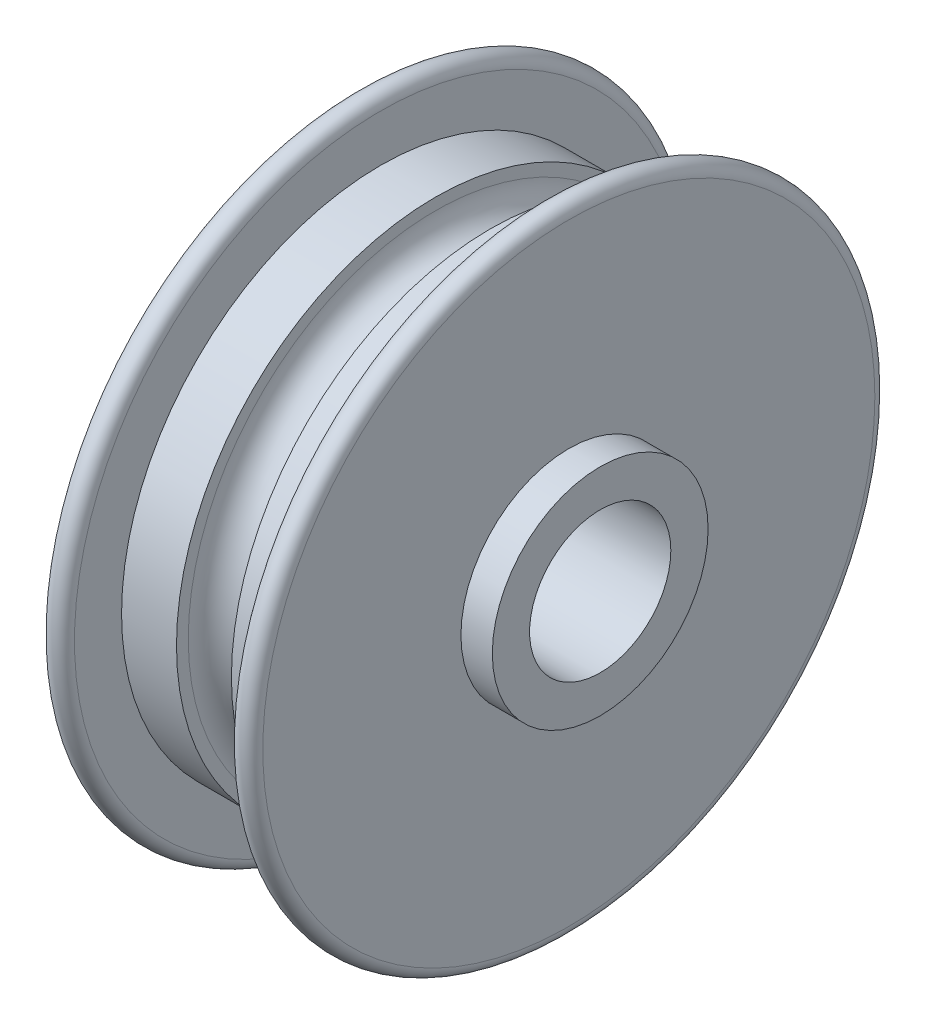
ISO-10303-21;
HEADER;
FILE_DESCRIPTION(('STEP AP214'),'2;1');
FILE_NAME('part.step','',(''),(''),'','','');
FILE_SCHEMA(('AUTOMOTIVE_DESIGN { 1 0 10303 214 1 1 1 1 }'));
ENDSEC;
DATA;
#1=APPLICATION_CONTEXT('core data for automotive mechanical design processes');
#2=APPLICATION_PROTOCOL_DEFINITION('international standard','automotive_design',2000,#1);
#3=PRODUCT_CONTEXT('',#1,'mechanical');
#4=PRODUCT('Part','Part','',(#3));
#5=PRODUCT_RELATED_PRODUCT_CATEGORY('part','',(#4));
#6=PRODUCT_DEFINITION_FORMATION('','',#4);
#7=PRODUCT_DEFINITION_CONTEXT('part definition',#1,'design');
#8=PRODUCT_DEFINITION('design','',#6,#7);
#9=PRODUCT_DEFINITION_SHAPE('','',#8);
#10=(LENGTH_UNIT() NAMED_UNIT(*) SI_UNIT(.MILLI.,.METRE.));
#11=(NAMED_UNIT(*) PLANE_ANGLE_UNIT() SI_UNIT($,.RADIAN.));
#12=(NAMED_UNIT(*) SI_UNIT($,.STERADIAN.) SOLID_ANGLE_UNIT());
#13=UNCERTAINTY_MEASURE_WITH_UNIT(LENGTH_MEASURE(1.E-05),#10,'distance_accuracy_value','');
#14=(GEOMETRIC_REPRESENTATION_CONTEXT(3) GLOBAL_UNCERTAINTY_ASSIGNED_CONTEXT((#13)) GLOBAL_UNIT_ASSIGNED_CONTEXT((#10,
#11,#12)) REPRESENTATION_CONTEXT('',''));
#15=CARTESIAN_POINT('',(0.,0.,0.));
#16=DIRECTION('',(0.,0.,1.));
#17=DIRECTION('',(1.,0.,0.));
#18=AXIS2_PLACEMENT_3D('',#15,#16,#17);
#19=CARTESIAN_POINT('',(-24.4615520047495,0.,0.));
#20=DIRECTION('',(1.,0.,0.));
#21=DIRECTION('',(0.,0.,-1.));
#22=AXIS2_PLACEMENT_3D('',#19,#20,#21);
#23=CYLINDRICAL_SURFACE('',#22,9.);
#24=CARTESIAN_POINT('',(26.1759133682077,0.,0.));
#25=DIRECTION('',(1.,0.,0.));
#26=DIRECTION('',(0.,0.,-1.));
#27=AXIS2_PLACEMENT_3D('',#24,#25,#26);
#28=CIRCLE('',#27,9.);
#29=CARTESIAN_POINT('',(26.1759133682077,0.,-9.));
#30=VERTEX_POINT('',#29);
#31=EDGE_CURVE('E10',#30,#30,#28,.T.);
#32=ORIENTED_EDGE('',*,*,#31,.T.);
#33=EDGE_LOOP('',(#32));
#34=FACE_BOUND('',#33,.T.);
#35=CARTESIAN_POINT('',(-8.82408663179228,0.,0.));
#36=DIRECTION('',(1.,0.,0.));
#37=DIRECTION('',(0.,0.,-1.));
#38=AXIS2_PLACEMENT_3D('',#35,#36,#37);
#39=CIRCLE('',#38,8.99999999999999);
#40=CARTESIAN_POINT('',(-8.82408663179228,0.,-8.99999999999999));
#41=VERTEX_POINT('',#40);
#42=EDGE_CURVE('E110',#41,#41,#39,.T.);
#43=ORIENTED_EDGE('',*,*,#42,.F.);
#44=EDGE_LOOP('',(#43));
#45=FACE_BOUND('',#44,.T.);
#46=ADVANCED_FACE('F43',(#34,#45),#23,.F.);
#47=CARTESIAN_POINT('',(26.1759133682077,0.,0.));
#48=DIRECTION('',(-1.,0.,0.));
#49=DIRECTION('',(0.,0.,1.));
#50=AXIS2_PLACEMENT_3D('',#47,#48,#49);
#51=PLANE('',#50);
#52=ORIENTED_EDGE('',*,*,#31,.F.);
#53=EDGE_LOOP('',(#52));
#54=FACE_BOUND('',#53,.T.);
#55=CARTESIAN_POINT('',(26.1759133682077,0.,0.));
#56=DIRECTION('',(1.,0.,0.));
#57=DIRECTION('',(0.,0.,-1.));
#58=AXIS2_PLACEMENT_3D('',#55,#56,#57);
#59=CIRCLE('',#58,13.75);
#60=CARTESIAN_POINT('',(26.1759133682077,0.,-13.75));
#61=VERTEX_POINT('',#60);
#62=EDGE_CURVE('E50',#61,#61,#59,.T.);
#63=ORIENTED_EDGE('',*,*,#62,.T.);
#64=EDGE_LOOP('',(#63));
#65=FACE_BOUND('',#64,.T.);
#66=ADVANCED_FACE('F119',(#54,#65),#51,.F.);
#67=CARTESIAN_POINT('',(-24.4615520047495,0.,0.));
#68=DIRECTION('',(1.,0.,0.));
#69=DIRECTION('',(0.,0.,-1.));
#70=AXIS2_PLACEMENT_3D('',#67,#68,#69);
#71=CYLINDRICAL_SURFACE('',#70,13.75);
#72=CARTESIAN_POINT('',(22.1759133682077,0.,0.));
#73=DIRECTION('',(1.,0.,0.));
#74=DIRECTION('',(0.,0.,-1.));
#75=AXIS2_PLACEMENT_3D('',#72,#73,#74);
#76=CIRCLE('',#75,13.75);
#77=CARTESIAN_POINT('',(22.1759133682077,0.,-13.75));
#78=VERTEX_POINT('',#77);
#79=EDGE_CURVE('E55',#78,#78,#76,.T.);
#80=ORIENTED_EDGE('',*,*,#79,.T.);
#81=EDGE_LOOP('',(#80));
#82=FACE_BOUND('',#81,.T.);
#83=ORIENTED_EDGE('',*,*,#62,.F.);
#84=EDGE_LOOP('',(#83));
#85=FACE_BOUND('',#84,.T.);
#86=ADVANCED_FACE('F123',(#82,#85),#71,.T.);
#87=CARTESIAN_POINT('',(22.1759133682077,0.,0.));
#88=DIRECTION('',(1.,0.,0.));
#89=DIRECTION('',(0.,0.,-1.));
#90=AXIS2_PLACEMENT_3D('',#87,#88,#89);
#91=PLANE('',#90);
#92=CARTESIAN_POINT('',(22.1759133682077,0.,0.));
#93=DIRECTION('',(1.,0.,0.));
#94=DIRECTION('',(0.,0.,-1.));
#95=AXIS2_PLACEMENT_3D('',#92,#93,#94);
#96=CIRCLE('',#95,39.);
#97=CARTESIAN_POINT('',(22.1759133682077,0.,-39.));
#98=VERTEX_POINT('',#97);
#99=EDGE_CURVE('E60',#98,#98,#96,.T.);
#100=ORIENTED_EDGE('',*,*,#99,.T.);
#101=EDGE_LOOP('',(#100));
#102=FACE_BOUND('',#101,.T.);
#103=ORIENTED_EDGE('',*,*,#79,.F.);
#104=EDGE_LOOP('',(#103));
#105=FACE_BOUND('',#104,.T.);
#106=ADVANCED_FACE('F128',(#102,#105),#91,.T.);
#107=CARTESIAN_POINT('',(20.6759133682077,0.,0.));
#108=DIRECTION('',(1.,0.,0.));
#109=DIRECTION('',(0.,0.,-1.));
#110=AXIS2_PLACEMENT_3D('',#107,#108,#109);
#111=TOROIDAL_SURFACE('',#110,39.,1.5);
#112=CARTESIAN_POINT('',(19.1759133682077,0.,0.));
#113=DIRECTION('',(1.,0.,0.));
#114=DIRECTION('',(0.,0.,-1.));
#115=AXIS2_PLACEMENT_3D('',#112,#113,#114);
#116=CIRCLE('',#115,39.);
#117=CARTESIAN_POINT('',(19.1759133682077,0.,-39.));
#118=VERTEX_POINT('',#117);
#119=EDGE_CURVE('E66',#118,#118,#116,.T.);
#120=ORIENTED_EDGE('',*,*,#119,.T.);
#121=EDGE_LOOP('',(#120));
#122=FACE_BOUND('',#121,.T.);
#123=ORIENTED_EDGE('',*,*,#99,.F.);
#124=EDGE_LOOP('',(#123));
#125=FACE_BOUND('',#124,.T.);
#126=ADVANCED_FACE('F134',(#122,#125),#111,.T.);
#127=CARTESIAN_POINT('',(19.1759133682077,0.,0.));
#128=DIRECTION('',(-1.,0.,0.));
#129=DIRECTION('',(0.,0.,1.));
#130=AXIS2_PLACEMENT_3D('',#127,#128,#129);
#131=PLANE('',#130);
#132=CARTESIAN_POINT('',(19.1759133682077,0.,0.));
#133=DIRECTION('',(1.,0.,0.));
#134=DIRECTION('',(0.,0.,-1.));
#135=AXIS2_PLACEMENT_3D('',#132,#133,#134);
#136=CIRCLE('',#135,33.);
#137=CARTESIAN_POINT('',(19.1759133682077,0.,-33.));
#138=VERTEX_POINT('',#137);
#139=EDGE_CURVE('E70',#138,#138,#136,.T.);
#140=ORIENTED_EDGE('',*,*,#139,.T.);
#141=EDGE_LOOP('',(#140));
#142=FACE_BOUND('',#141,.T.);
#143=ORIENTED_EDGE('',*,*,#119,.F.);
#144=EDGE_LOOP('',(#143));
#145=FACE_BOUND('',#144,.T.);
#146=ADVANCED_FACE('F138',(#142,#145),#131,.T.);
#147=CARTESIAN_POINT('',(-24.4615520047495,0.,0.));
#148=DIRECTION('',(1.,0.,0.));
#149=DIRECTION('',(0.,0.,-1.));
#150=AXIS2_PLACEMENT_3D('',#147,#148,#149);
#151=CYLINDRICAL_SURFACE('',#150,33.);
#152=ORIENTED_EDGE('',*,*,#139,.F.);
#153=EDGE_LOOP('',(#152));
#154=FACE_BOUND('',#153,.T.);
#155=CARTESIAN_POINT('',(12.1759133682077,0.,0.));
#156=DIRECTION('',(1.,0.,0.));
#157=DIRECTION('',(0.,0.,-1.));
#158=AXIS2_PLACEMENT_3D('',#155,#156,#157);
#159=CIRCLE('',#158,33.);
#160=CARTESIAN_POINT('',(12.1759133682077,0.,-33.));
#161=VERTEX_POINT('',#160);
#162=EDGE_CURVE('E74',#161,#161,#159,.T.);
#163=ORIENTED_EDGE('',*,*,#162,.T.);
#164=EDGE_LOOP('',(#163));
#165=FACE_BOUND('',#164,.T.);
#166=ADVANCED_FACE('F142',(#154,#165),#151,.T.);
#167=CARTESIAN_POINT('',(12.1759133682077,0.,0.));
#168=DIRECTION('',(1.,0.,0.));
#169=DIRECTION('',(0.,0.,-1.));
#170=AXIS2_PLACEMENT_3D('',#167,#168,#169);
#171=PLANE('',#170);
#172=ORIENTED_EDGE('',*,*,#162,.F.);
#173=EDGE_LOOP('',(#172));
#174=FACE_BOUND('',#173,.T.);
#175=CARTESIAN_POINT('',(12.1759133682077,0.,0.));
#176=DIRECTION('',(1.,0.,0.));
#177=DIRECTION('',(0.,0.,-1.));
#178=AXIS2_PLACEMENT_3D('',#175,#176,#177);
#179=CIRCLE('',#178,31.5);
#180=CARTESIAN_POINT('',(12.1759133682077,0.,-31.5));
#181=VERTEX_POINT('',#180);
#182=EDGE_CURVE('E78',#181,#181,#179,.T.);
#183=ORIENTED_EDGE('',*,*,#182,.T.);
#184=EDGE_LOOP('',(#183));
#185=FACE_BOUND('',#184,.T.);
#186=ADVANCED_FACE('F146',(#174,#185),#171,.F.);
#187=CARTESIAN_POINT('',(8.67591336820773,0.,0.));
#188=DIRECTION('',(1.,0.,0.));
#189=DIRECTION('',(0.,0.,-1.));
#190=AXIS2_PLACEMENT_3D('',#187,#188,#189);
#191=TOROIDAL_SURFACE('',#190,31.5,3.5);
#192=ORIENTED_EDGE('',*,*,#182,.F.);
#193=EDGE_LOOP('',(#192));
#194=FACE_BOUND('',#193,.T.);
#195=CARTESIAN_POINT('',(5.17591336820772,0.,0.));
#196=DIRECTION('',(1.,0.,0.));
#197=DIRECTION('',(0.,0.,-1.));
#198=AXIS2_PLACEMENT_3D('',#195,#196,#197);
#199=CIRCLE('',#198,31.5);
#200=CARTESIAN_POINT('',(5.17591336820772,0.,-31.5));
#201=VERTEX_POINT('',#200);
#202=EDGE_CURVE('E82',#201,#201,#199,.T.);
#203=ORIENTED_EDGE('',*,*,#202,.T.);
#204=EDGE_LOOP('',(#203));
#205=FACE_BOUND('',#204,.T.);
#206=ADVANCED_FACE('F150',(#194,#205),#191,.F.);
#207=CARTESIAN_POINT('',(5.17591336820772,0.,0.));
#208=DIRECTION('',(-1.,0.,0.));
#209=DIRECTION('',(0.,0.,1.));
#210=AXIS2_PLACEMENT_3D('',#207,#208,#209);
#211=PLANE('',#210);
#212=ORIENTED_EDGE('',*,*,#202,.F.);
#213=EDGE_LOOP('',(#212));
#214=FACE_BOUND('',#213,.T.);
#215=CARTESIAN_POINT('',(5.17591336820772,0.,0.));
#216=DIRECTION('',(1.,0.,0.));
#217=DIRECTION('',(0.,0.,-1.));
#218=AXIS2_PLACEMENT_3D('',#215,#216,#217);
#219=CIRCLE('',#218,33.);
#220=CARTESIAN_POINT('',(5.17591336820772,0.,-33.));
#221=VERTEX_POINT('',#220);
#222=EDGE_CURVE('E86',#221,#221,#219,.T.);
#223=ORIENTED_EDGE('',*,*,#222,.T.);
#224=EDGE_LOOP('',(#223));
#225=FACE_BOUND('',#224,.T.);
#226=ADVANCED_FACE('F154',(#214,#225),#211,.F.);
#227=CARTESIAN_POINT('',(-24.4615520047495,0.,0.));
#228=DIRECTION('',(1.,0.,0.));
#229=DIRECTION('',(0.,0.,-1.));
#230=AXIS2_PLACEMENT_3D('',#227,#228,#229);
#231=CYLINDRICAL_SURFACE('',#230,33.);
#232=ORIENTED_EDGE('',*,*,#222,.F.);
#233=EDGE_LOOP('',(#232));
#234=FACE_BOUND('',#233,.T.);
#235=CARTESIAN_POINT('',(-1.82408663179228,0.,0.));
#236=DIRECTION('',(1.,0.,0.));
#237=DIRECTION('',(0.,0.,-1.));
#238=AXIS2_PLACEMENT_3D('',#235,#236,#237);
#239=CIRCLE('',#238,33.);
#240=CARTESIAN_POINT('',(-1.82408663179228,0.,-33.));
#241=VERTEX_POINT('',#240);
#242=EDGE_CURVE('E90',#241,#241,#239,.T.);
#243=ORIENTED_EDGE('',*,*,#242,.T.);
#244=EDGE_LOOP('',(#243));
#245=FACE_BOUND('',#244,.T.);
#246=ADVANCED_FACE('F158',(#234,#245),#231,.T.);
#247=CARTESIAN_POINT('',(-1.82408663179228,0.,0.));
#248=DIRECTION('',(-1.,0.,0.));
#249=DIRECTION('',(0.,0.,1.));
#250=AXIS2_PLACEMENT_3D('',#247,#248,#249);
#251=PLANE('',#250);
#252=ORIENTED_EDGE('',*,*,#242,.F.);
#253=EDGE_LOOP('',(#252));
#254=FACE_BOUND('',#253,.T.);
#255=CARTESIAN_POINT('',(-1.82408663179228,0.,0.));
#256=DIRECTION('',(1.,0.,0.));
#257=DIRECTION('',(0.,0.,-1.));
#258=AXIS2_PLACEMENT_3D('',#255,#256,#257);
#259=CIRCLE('',#258,39.);
#260=CARTESIAN_POINT('',(-1.82408663179228,0.,-39.));
#261=VERTEX_POINT('',#260);
#262=EDGE_CURVE('E94',#261,#261,#259,.T.);
#263=ORIENTED_EDGE('',*,*,#262,.T.);
#264=EDGE_LOOP('',(#263));
#265=FACE_BOUND('',#264,.T.);
#266=ADVANCED_FACE('F162',(#254,#265),#251,.F.);
#267=CARTESIAN_POINT('',(-3.32408663179228,0.,0.));
#268=DIRECTION('',(1.,0.,0.));
#269=DIRECTION('',(0.,0.,-1.));
#270=AXIS2_PLACEMENT_3D('',#267,#268,#269);
#271=TOROIDAL_SURFACE('',#270,39.,1.5);
#272=ORIENTED_EDGE('',*,*,#262,.F.);
#273=EDGE_LOOP('',(#272));
#274=FACE_BOUND('',#273,.T.);
#275=CARTESIAN_POINT('',(-4.82408663179228,0.,0.));
#276=DIRECTION('',(1.,0.,0.));
#277=DIRECTION('',(0.,0.,-1.));
#278=AXIS2_PLACEMENT_3D('',#275,#276,#277);
#279=CIRCLE('',#278,39.);
#280=CARTESIAN_POINT('',(-4.82408663179228,0.,-39.));
#281=VERTEX_POINT('',#280);
#282=EDGE_CURVE('E98',#281,#281,#279,.T.);
#283=ORIENTED_EDGE('',*,*,#282,.T.);
#284=EDGE_LOOP('',(#283));
#285=FACE_BOUND('',#284,.T.);
#286=ADVANCED_FACE('F166',(#274,#285),#271,.T.);
#287=CARTESIAN_POINT('',(-4.82408663179228,0.,0.));
#288=DIRECTION('',(1.,0.,0.));
#289=DIRECTION('',(0.,0.,-1.));
#290=AXIS2_PLACEMENT_3D('',#287,#288,#289);
#291=PLANE('',#290);
#292=ORIENTED_EDGE('',*,*,#282,.F.);
#293=EDGE_LOOP('',(#292));
#294=FACE_BOUND('',#293,.T.);
#295=CARTESIAN_POINT('',(-4.82408663179228,0.,0.));
#296=DIRECTION('',(1.,0.,0.));
#297=DIRECTION('',(0.,0.,-1.));
#298=AXIS2_PLACEMENT_3D('',#295,#296,#297);
#299=CIRCLE('',#298,13.75);
#300=CARTESIAN_POINT('',(-4.82408663179228,0.,-13.75));
#301=VERTEX_POINT('',#300);
#302=EDGE_CURVE('E102',#301,#301,#299,.T.);
#303=ORIENTED_EDGE('',*,*,#302,.T.);
#304=EDGE_LOOP('',(#303));
#305=FACE_BOUND('',#304,.T.);
#306=ADVANCED_FACE('F170',(#294,#305),#291,.F.);
#307=CARTESIAN_POINT('',(-24.4615520047495,0.,0.));
#308=DIRECTION('',(1.,0.,0.));
#309=DIRECTION('',(0.,0.,-1.));
#310=AXIS2_PLACEMENT_3D('',#307,#308,#309);
#311=CYLINDRICAL_SURFACE('',#310,13.75);
#312=ORIENTED_EDGE('',*,*,#302,.F.);
#313=EDGE_LOOP('',(#312));
#314=FACE_BOUND('',#313,.T.);
#315=CARTESIAN_POINT('',(-8.82408663179228,0.,0.));
#316=DIRECTION('',(1.,0.,0.));
#317=DIRECTION('',(0.,0.,-1.));
#318=AXIS2_PLACEMENT_3D('',#315,#316,#317);
#319=CIRCLE('',#318,13.75);
#320=CARTESIAN_POINT('',(-8.82408663179228,0.,-13.75));
#321=VERTEX_POINT('',#320);
#322=EDGE_CURVE('E106',#321,#321,#319,.T.);
#323=ORIENTED_EDGE('',*,*,#322,.T.);
#324=EDGE_LOOP('',(#323));
#325=FACE_BOUND('',#324,.T.);
#326=ADVANCED_FACE('F174',(#314,#325),#311,.T.);
#327=CARTESIAN_POINT('',(-8.82408663179228,0.,0.));
#328=DIRECTION('',(-1.,0.,0.));
#329=DIRECTION('',(0.,0.,1.));
#330=AXIS2_PLACEMENT_3D('',#327,#328,#329);
#331=PLANE('',#330);
#332=ORIENTED_EDGE('',*,*,#42,.T.);
#333=EDGE_LOOP('',(#332));
#334=FACE_BOUND('',#333,.T.);
#335=ORIENTED_EDGE('',*,*,#322,.F.);
#336=EDGE_LOOP('',(#335));
#337=FACE_BOUND('',#336,.T.);
#338=ADVANCED_FACE('F115',(#334,#337),#331,.T.);
#339=CLOSED_SHELL('',(#46,#66,#86,#106,#126,#146,#166,#186,#206,#226,#246,#266,#286,#306,#326,#338));
#340=MANIFOLD_SOLID_BREP('B2',#339);
#341=ADVANCED_BREP_SHAPE_REPRESENTATION('',(#18,#340),#14);
#342=SHAPE_DEFINITION_REPRESENTATION(#9,#341);
ENDSEC;
END-ISO-10303-21;
